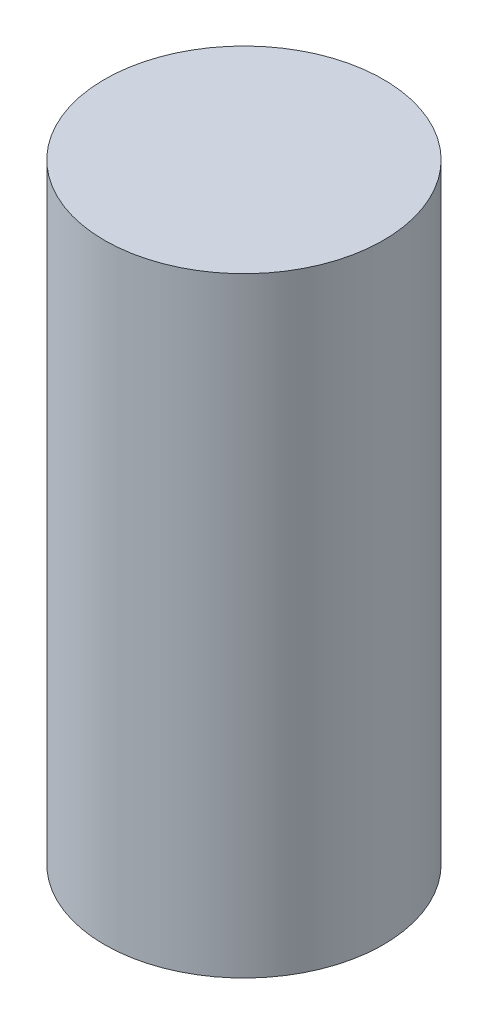
ISO-10303-21;
HEADER;
FILE_DESCRIPTION(('STEP AP214'),'2;1');
FILE_NAME('part.step','',(''),(''),'','','');
FILE_SCHEMA(('AUTOMOTIVE_DESIGN { 1 0 10303 214 1 1 1 1 }'));
ENDSEC;
DATA;
#1=APPLICATION_CONTEXT('core data for automotive mechanical design processes');
#2=APPLICATION_PROTOCOL_DEFINITION('international standard','automotive_design',2000,#1);
#3=PRODUCT_CONTEXT('',#1,'mechanical');
#4=PRODUCT('Part','Part','',(#3));
#5=PRODUCT_RELATED_PRODUCT_CATEGORY('part','',(#4));
#6=PRODUCT_DEFINITION_FORMATION('','',#4);
#7=PRODUCT_DEFINITION_CONTEXT('part definition',#1,'design');
#8=PRODUCT_DEFINITION('design','',#6,#7);
#9=PRODUCT_DEFINITION_SHAPE('','',#8);
#10=(LENGTH_UNIT() NAMED_UNIT(*) SI_UNIT(.MILLI.,.METRE.));
#11=(NAMED_UNIT(*) PLANE_ANGLE_UNIT() SI_UNIT($,.RADIAN.));
#12=(NAMED_UNIT(*) SI_UNIT($,.STERADIAN.) SOLID_ANGLE_UNIT());
#13=UNCERTAINTY_MEASURE_WITH_UNIT(LENGTH_MEASURE(1.E-05),#10,'distance_accuracy_value','');
#14=(GEOMETRIC_REPRESENTATION_CONTEXT(3) GLOBAL_UNCERTAINTY_ASSIGNED_CONTEXT((#13)) GLOBAL_UNIT_ASSIGNED_CONTEXT((#10,
#11,#12)) REPRESENTATION_CONTEXT('',''));
#15=CARTESIAN_POINT('',(0.,0.,0.));
#16=DIRECTION('',(0.,0.,1.));
#17=DIRECTION('',(1.,0.,0.));
#18=AXIS2_PLACEMENT_3D('',#15,#16,#17);
#19=CARTESIAN_POINT('',(0.,1000.,0.));
#20=DIRECTION('',(0.,-1.,0.));
#21=DIRECTION('',(0.,0.,-1.));
#22=AXIS2_PLACEMENT_3D('',#19,#20,#21);
#23=CYLINDRICAL_SURFACE('',#22,228.6);
#24=CARTESIAN_POINT('',(0.,1000.,0.));
#25=DIRECTION('',(0.,1.,0.));
#26=DIRECTION('',(0.,0.,1.));
#27=AXIS2_PLACEMENT_3D('',#24,#25,#26);
#28=CIRCLE('',#27,228.6);
#29=CARTESIAN_POINT('',(0.,1000.,228.6));
#30=VERTEX_POINT('',#29);
#31=EDGE_CURVE('E10',#30,#30,#28,.T.);
#32=ORIENTED_EDGE('',*,*,#31,.F.);
#33=EDGE_LOOP('',(#32));
#34=FACE_BOUND('',#33,.T.);
#35=CARTESIAN_POINT('',(0.,0.,0.));
#36=DIRECTION('',(0.,1.,0.));
#37=DIRECTION('',(0.,0.,1.));
#38=AXIS2_PLACEMENT_3D('',#35,#36,#37);
#39=CIRCLE('',#38,228.6);
#40=CARTESIAN_POINT('',(0.,0.,228.6));
#41=VERTEX_POINT('',#40);
#42=EDGE_CURVE('E34',#41,#41,#39,.T.);
#43=ORIENTED_EDGE('',*,*,#42,.T.);
#44=EDGE_LOOP('',(#43));
#45=FACE_BOUND('',#44,.T.);
#46=ADVANCED_FACE('F31',(#34,#45),#23,.T.);
#47=CARTESIAN_POINT('',(0.,1000.,0.));
#48=DIRECTION('',(0.,1.,0.));
#49=DIRECTION('',(0.,0.,1.));
#50=AXIS2_PLACEMENT_3D('',#47,#48,#49);
#51=PLANE('',#50);
#52=ORIENTED_EDGE('',*,*,#31,.T.);
#53=EDGE_LOOP('',(#52));
#54=FACE_BOUND('',#53,.T.);
#55=ADVANCED_FACE('F46',(#54),#51,.T.);
#56=CARTESIAN_POINT('',(0.,0.,0.));
#57=DIRECTION('',(0.,1.,0.));
#58=DIRECTION('',(0.,0.,1.));
#59=AXIS2_PLACEMENT_3D('',#56,#57,#58);
#60=PLANE('',#59);
#61=ORIENTED_EDGE('',*,*,#42,.F.);
#62=EDGE_LOOP('',(#61));
#63=FACE_BOUND('',#62,.T.);
#64=ADVANCED_FACE('F44',(#63),#60,.F.);
#65=CLOSED_SHELL('',(#46,#55,#64));
#66=MANIFOLD_SOLID_BREP('B2',#65);
#67=ADVANCED_BREP_SHAPE_REPRESENTATION('',(#18,#66),#14);
#68=SHAPE_DEFINITION_REPRESENTATION(#9,#67);
ENDSEC;
END-ISO-10303-21;
